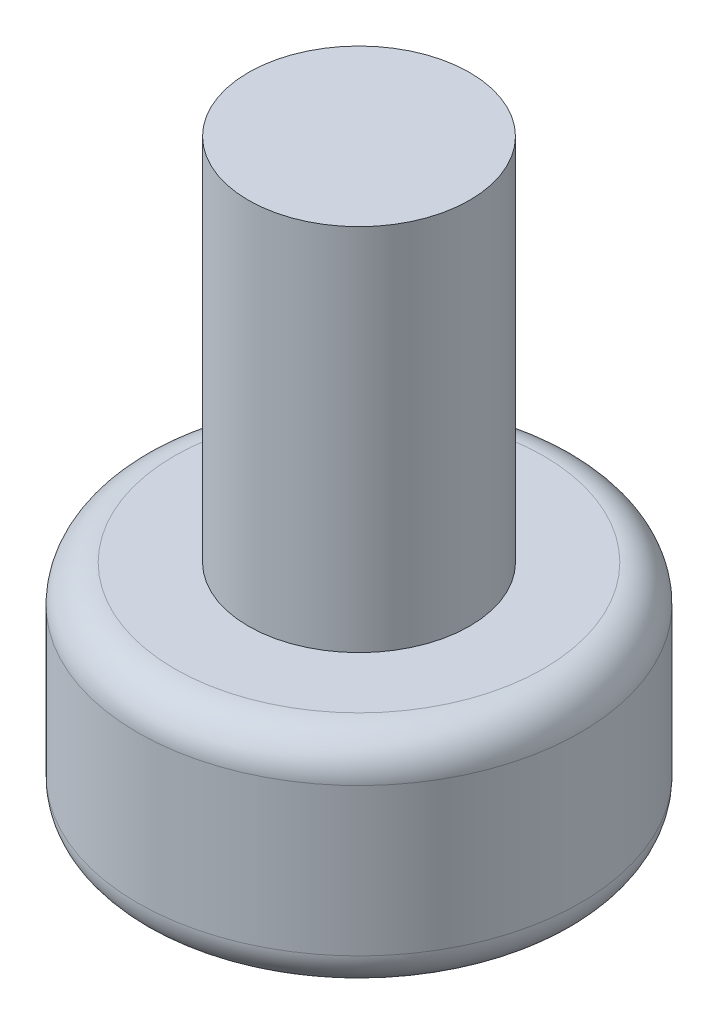
ISO-10303-21;
HEADER;
FILE_DESCRIPTION(('STEP AP214'),'2;1');
FILE_NAME('part.step','',(''),(''),'','','');
FILE_SCHEMA(('AUTOMOTIVE_DESIGN { 1 0 10303 214 1 1 1 1 }'));
ENDSEC;
DATA;
#1=APPLICATION_CONTEXT('core data for automotive mechanical design processes');
#2=APPLICATION_PROTOCOL_DEFINITION('international standard','automotive_design',2000,#1);
#3=PRODUCT_CONTEXT('',#1,'mechanical');
#4=PRODUCT('Part','Part','',(#3));
#5=PRODUCT_RELATED_PRODUCT_CATEGORY('part','',(#4));
#6=PRODUCT_DEFINITION_FORMATION('','',#4);
#7=PRODUCT_DEFINITION_CONTEXT('part definition',#1,'design');
#8=PRODUCT_DEFINITION('design','',#6,#7);
#9=PRODUCT_DEFINITION_SHAPE('','',#8);
#10=(LENGTH_UNIT() NAMED_UNIT(*) SI_UNIT(.MILLI.,.METRE.));
#11=(NAMED_UNIT(*) PLANE_ANGLE_UNIT() SI_UNIT($,.RADIAN.));
#12=(NAMED_UNIT(*) SI_UNIT($,.STERADIAN.) SOLID_ANGLE_UNIT());
#13=UNCERTAINTY_MEASURE_WITH_UNIT(LENGTH_MEASURE(1.E-05),#10,'distance_accuracy_value','');
#14=(GEOMETRIC_REPRESENTATION_CONTEXT(3) GLOBAL_UNCERTAINTY_ASSIGNED_CONTEXT((#13)) GLOBAL_UNIT_ASSIGNED_CONTEXT((#10,
#11,#12)) REPRESENTATION_CONTEXT('',''));
#15=CARTESIAN_POINT('',(0.,0.,0.));
#16=DIRECTION('',(0.,0.,1.));
#17=DIRECTION('',(1.,0.,0.));
#18=AXIS2_PLACEMENT_3D('',#15,#16,#17);
#19=CARTESIAN_POINT('',(0.,3.,0.));
#20=DIRECTION('',(0.,-1.,0.));
#21=DIRECTION('',(0.,0.,-1.));
#22=AXIS2_PLACEMENT_3D('',#19,#20,#21);
#23=CYLINDRICAL_SURFACE('',#22,3.);
#24=CARTESIAN_POINT('',(0.,0.5,0.));
#25=DIRECTION('',(0.,1.,0.));
#26=DIRECTION('',(0.,0.,1.));
#27=AXIS2_PLACEMENT_3D('',#24,#25,#26);
#28=CIRCLE('',#27,3.);
#29=CARTESIAN_POINT('',(0.,0.5,3.));
#30=VERTEX_POINT('',#29);
#31=EDGE_CURVE('E148',#30,#30,#28,.T.);
#32=ORIENTED_EDGE('',*,*,#31,.T.);
#33=EDGE_LOOP('',(#32));
#34=FACE_BOUND('',#33,.T.);
#35=CARTESIAN_POINT('',(0.,2.5,0.));
#36=DIRECTION('',(0.,1.,0.));
#37=DIRECTION('',(0.,0.,1.));
#38=AXIS2_PLACEMENT_3D('',#35,#36,#37);
#39=CIRCLE('',#38,3.);
#40=CARTESIAN_POINT('',(0.,2.5,3.));
#41=VERTEX_POINT('',#40);
#42=EDGE_CURVE('E143',#41,#41,#39,.F.);
#43=ORIENTED_EDGE('',*,*,#42,.T.);
#44=EDGE_LOOP('',(#43));
#45=FACE_BOUND('',#44,.T.);
#46=ADVANCED_FACE('F32',(#34,#45),#23,.T.);
#47=CARTESIAN_POINT('',(0.,3.,0.));
#48=DIRECTION('',(0.,1.,0.));
#49=DIRECTION('',(0.,0.,1.));
#50=AXIS2_PLACEMENT_3D('',#47,#48,#49);
#51=PLANE('',#50);
#52=CARTESIAN_POINT('',(0.,3.,0.));
#53=DIRECTION('',(0.,1.,0.));
#54=DIRECTION('',(0.,0.,1.));
#55=AXIS2_PLACEMENT_3D('',#52,#53,#54);
#56=CIRCLE('',#55,2.5);
#57=CARTESIAN_POINT('',(0.,3.,2.5));
#58=VERTEX_POINT('',#57);
#59=EDGE_CURVE('E11',#58,#58,#56,.T.);
#60=ORIENTED_EDGE('',*,*,#59,.T.);
#61=EDGE_LOOP('',(#60));
#62=FACE_BOUND('',#61,.T.);
#63=CARTESIAN_POINT('',(0.,3.,0.));
#64=DIRECTION('',(0.,1.,0.));
#65=DIRECTION('',(0.,0.,1.));
#66=AXIS2_PLACEMENT_3D('',#63,#64,#65);
#67=CIRCLE('',#66,1.5);
#68=CARTESIAN_POINT('',(0.,3.,1.5));
#69=VERTEX_POINT('',#68);
#70=EDGE_CURVE('E134',#69,#69,#67,.T.);
#71=ORIENTED_EDGE('',*,*,#70,.F.);
#72=EDGE_LOOP('',(#71));
#73=FACE_BOUND('',#72,.T.);
#74=ADVANCED_FACE('F163',(#62,#73),#51,.T.);
#75=CARTESIAN_POINT('',(0.,0.,0.));
#76=DIRECTION('',(0.,1.,0.));
#77=DIRECTION('',(0.,0.,1.));
#78=AXIS2_PLACEMENT_3D('',#75,#76,#77);
#79=PLANE('',#78);
#80=DIRECTION('',(-0.5,0.,0.866025403784438));
#81=VECTOR('',#80,1.);
#82=CARTESIAN_POINT('',(1.73205080756888,0.,0.));
#83=LINE('',#82,#81);
#84=CARTESIAN_POINT('',(1.73205080756888,0.,0.));
#85=VERTEX_POINT('',#84);
#86=CARTESIAN_POINT('',(0.866025403784438,0.,1.5));
#87=VERTEX_POINT('',#86);
#88=EDGE_CURVE('E121',#85,#87,#83,.T.);
#89=ORIENTED_EDGE('',*,*,#88,.F.);
#90=DIRECTION('',(0.5,0.,0.866025403784439));
#91=VECTOR('',#90,1.);
#92=CARTESIAN_POINT('',(0.866025403784438,0.,-1.5));
#93=LINE('',#92,#91);
#94=CARTESIAN_POINT('',(0.866025403784438,0.,-1.5));
#95=VERTEX_POINT('',#94);
#96=EDGE_CURVE('E47',#95,#85,#93,.T.);
#97=ORIENTED_EDGE('',*,*,#96,.F.);
#98=DIRECTION('',(1.,0.,0.));
#99=VECTOR('',#98,1.);
#100=CARTESIAN_POINT('',(-0.866025403784439,0.,-1.5));
#101=LINE('',#100,#99);
#102=CARTESIAN_POINT('',(-0.866025403784439,0.,-1.5));
#103=VERTEX_POINT('',#102);
#104=EDGE_CURVE('E130',#103,#95,#101,.T.);
#105=ORIENTED_EDGE('',*,*,#104,.F.);
#106=DIRECTION('',(0.5,0.,-0.866025403784439));
#107=VECTOR('',#106,1.);
#108=CARTESIAN_POINT('',(-1.73205080756888,0.,0.));
#109=LINE('',#108,#107);
#110=CARTESIAN_POINT('',(-1.73205080756888,0.,0.));
#111=VERTEX_POINT('',#110);
#112=EDGE_CURVE('E128',#111,#103,#109,.T.);
#113=ORIENTED_EDGE('',*,*,#112,.F.);
#114=DIRECTION('',(-0.5,0.,-0.866025403784439));
#115=VECTOR('',#114,1.);
#116=CARTESIAN_POINT('',(-0.866025403784439,0.,1.5));
#117=LINE('',#116,#115);
#118=CARTESIAN_POINT('',(-0.866025403784439,0.,1.5));
#119=VERTEX_POINT('',#118);
#120=EDGE_CURVE('E95',#119,#111,#117,.T.);
#121=ORIENTED_EDGE('',*,*,#120,.F.);
#122=DIRECTION('',(-1.,0.,0.));
#123=VECTOR('',#122,1.);
#124=CARTESIAN_POINT('',(0.866025403784438,0.,1.5));
#125=LINE('',#124,#123);
#126=EDGE_CURVE('E124',#87,#119,#125,.T.);
#127=ORIENTED_EDGE('',*,*,#126,.F.);
#128=EDGE_LOOP('',(#89,#97,#105,#113,#121,#127));
#129=FACE_BOUND('',#128,.T.);
#130=CARTESIAN_POINT('',(0.,0.,0.));
#131=DIRECTION('',(0.,1.,0.));
#132=DIRECTION('',(0.,0.,1.));
#133=AXIS2_PLACEMENT_3D('',#130,#131,#132);
#134=CIRCLE('',#133,2.5);
#135=CARTESIAN_POINT('',(0.,0.,2.5));
#136=VERTEX_POINT('',#135);
#137=EDGE_CURVE('E40',#136,#136,#134,.F.);
#138=ORIENTED_EDGE('',*,*,#137,.T.);
#139=EDGE_LOOP('',(#138));
#140=FACE_BOUND('',#139,.T.);
#141=ADVANCED_FACE('F153',(#129,#140),#79,.F.);
#142=CARTESIAN_POINT('',(0.,8.,0.));
#143=DIRECTION('',(0.,-1.,0.));
#144=DIRECTION('',(0.,0.,-1.));
#145=AXIS2_PLACEMENT_3D('',#142,#143,#144);
#146=CYLINDRICAL_SURFACE('',#145,1.5);
#147=CARTESIAN_POINT('',(0.,8.,0.));
#148=DIRECTION('',(0.,1.,0.));
#149=DIRECTION('',(0.,0.,1.));
#150=AXIS2_PLACEMENT_3D('',#147,#148,#149);
#151=CIRCLE('',#150,1.5);
#152=CARTESIAN_POINT('',(0.,8.,1.5));
#153=VERTEX_POINT('',#152);
#154=EDGE_CURVE('E140',#153,#153,#151,.T.);
#155=ORIENTED_EDGE('',*,*,#154,.F.);
#156=EDGE_LOOP('',(#155));
#157=FACE_BOUND('',#156,.T.);
#158=ORIENTED_EDGE('',*,*,#70,.T.);
#159=EDGE_LOOP('',(#158));
#160=FACE_BOUND('',#159,.T.);
#161=ADVANCED_FACE('F177',(#157,#160),#146,.T.);
#162=CARTESIAN_POINT('',(0.,8.,0.));
#163=DIRECTION('',(0.,1.,0.));
#164=DIRECTION('',(0.,0.,1.));
#165=AXIS2_PLACEMENT_3D('',#162,#163,#164);
#166=PLANE('',#165);
#167=ORIENTED_EDGE('',*,*,#154,.T.);
#168=EDGE_LOOP('',(#167));
#169=FACE_BOUND('',#168,.T.);
#170=ADVANCED_FACE('F158',(#169),#166,.T.);
#171=CARTESIAN_POINT('',(0.,0.5,0.));
#172=DIRECTION('',(0.,1.,0.));
#173=DIRECTION('',(0.,0.,1.));
#174=AXIS2_PLACEMENT_3D('',#171,#172,#173);
#175=TOROIDAL_SURFACE('',#174,2.5,0.5);
#176=ORIENTED_EDGE('',*,*,#137,.F.);
#177=EDGE_LOOP('',(#176));
#178=FACE_BOUND('',#177,.T.);
#179=ORIENTED_EDGE('',*,*,#31,.F.);
#180=EDGE_LOOP('',(#179));
#181=FACE_BOUND('',#180,.T.);
#182=ADVANCED_FACE('F155',(#178,#181),#175,.T.);
#183=CARTESIAN_POINT('',(0.,2.5,0.));
#184=DIRECTION('',(0.,1.,0.));
#185=DIRECTION('',(0.,0.,1.));
#186=AXIS2_PLACEMENT_3D('',#183,#184,#185);
#187=TOROIDAL_SURFACE('',#186,2.5,0.5);
#188=ORIENTED_EDGE('',*,*,#42,.F.);
#189=EDGE_LOOP('',(#188));
#190=FACE_BOUND('',#189,.T.);
#191=ORIENTED_EDGE('',*,*,#59,.F.);
#192=EDGE_LOOP('',(#191));
#193=FACE_BOUND('',#192,.T.);
#194=ADVANCED_FACE('F34',(#190,#193),#187,.T.);
#195=CARTESIAN_POINT('',(0.866025403784438,2.,-1.5));
#196=DIRECTION('',(0.866025403784439,0.,-0.5));
#197=DIRECTION('',(-0.5,0.,-0.866025403784439));
#198=AXIS2_PLACEMENT_3D('',#195,#196,#197);
#199=PLANE('',#198);
#200=ORIENTED_EDGE('',*,*,#96,.T.);
#201=DIRECTION('',(0.,-1.,0.));
#202=VECTOR('',#201,1.);
#203=CARTESIAN_POINT('',(1.73205080756888,2.,0.));
#204=LINE('',#203,#202);
#205=CARTESIAN_POINT('',(1.73205080756888,2.,0.));
#206=VERTEX_POINT('',#205);
#207=EDGE_CURVE('E77',#206,#85,#204,.T.);
#208=ORIENTED_EDGE('',*,*,#207,.F.);
#209=DIRECTION('',(0.5,0.,0.866025403784439));
#210=VECTOR('',#209,1.);
#211=CARTESIAN_POINT('',(0.866025403784438,2.,-1.5));
#212=LINE('',#211,#210);
#213=CARTESIAN_POINT('',(0.866025403784438,2.,-1.5));
#214=VERTEX_POINT('',#213);
#215=EDGE_CURVE('E132',#214,#206,#212,.T.);
#216=ORIENTED_EDGE('',*,*,#215,.F.);
#217=DIRECTION('',(0.,-1.,0.));
#218=VECTOR('',#217,1.);
#219=CARTESIAN_POINT('',(0.866025403784438,2.,-1.5));
#220=LINE('',#219,#218);
#221=EDGE_CURVE('E55',#214,#95,#220,.T.);
#222=ORIENTED_EDGE('',*,*,#221,.T.);
#223=EDGE_LOOP('',(#200,#208,#216,#222));
#224=FACE_BOUND('',#223,.T.);
#225=ADVANCED_FACE('F169',(#224),#199,.F.);
#226=CARTESIAN_POINT('',(-0.866025403784439,2.,-1.5));
#227=DIRECTION('',(0.,0.,-1.));
#228=DIRECTION('',(-1.,0.,0.));
#229=AXIS2_PLACEMENT_3D('',#226,#227,#228);
#230=PLANE('',#229);
#231=ORIENTED_EDGE('',*,*,#104,.T.);
#232=ORIENTED_EDGE('',*,*,#221,.F.);
#233=DIRECTION('',(1.,0.,0.));
#234=VECTOR('',#233,1.);
#235=CARTESIAN_POINT('',(-0.866025403784439,2.,-1.5));
#236=LINE('',#235,#234);
#237=CARTESIAN_POINT('',(-0.866025403784439,2.,-1.5));
#238=VERTEX_POINT('',#237);
#239=EDGE_CURVE('E107',#238,#214,#236,.T.);
#240=ORIENTED_EDGE('',*,*,#239,.F.);
#241=DIRECTION('',(0.,-1.,0.));
#242=VECTOR('',#241,1.);
#243=CARTESIAN_POINT('',(-0.866025403784439,2.,-1.5));
#244=LINE('',#243,#242);
#245=EDGE_CURVE('E99',#238,#103,#244,.T.);
#246=ORIENTED_EDGE('',*,*,#245,.T.);
#247=EDGE_LOOP('',(#231,#232,#240,#246));
#248=FACE_BOUND('',#247,.T.);
#249=ADVANCED_FACE('F193',(#248),#230,.F.);
#250=CARTESIAN_POINT('',(-1.73205080756888,2.,0.));
#251=DIRECTION('',(-0.866025403784439,0.,-0.5));
#252=DIRECTION('',(-0.5,0.,0.866025403784439));
#253=AXIS2_PLACEMENT_3D('',#250,#251,#252);
#254=PLANE('',#253);
#255=ORIENTED_EDGE('',*,*,#112,.T.);
#256=ORIENTED_EDGE('',*,*,#245,.F.);
#257=DIRECTION('',(0.5,0.,-0.866025403784439));
#258=VECTOR('',#257,1.);
#259=CARTESIAN_POINT('',(-1.73205080756888,2.,0.));
#260=LINE('',#259,#258);
#261=CARTESIAN_POINT('',(-1.73205080756888,2.,0.));
#262=VERTEX_POINT('',#261);
#263=EDGE_CURVE('E103',#262,#238,#260,.T.);
#264=ORIENTED_EDGE('',*,*,#263,.F.);
#265=DIRECTION('',(0.,-1.,0.));
#266=VECTOR('',#265,1.);
#267=CARTESIAN_POINT('',(-1.73205080756888,2.,0.));
#268=LINE('',#267,#266);
#269=EDGE_CURVE('E88',#262,#111,#268,.T.);
#270=ORIENTED_EDGE('',*,*,#269,.T.);
#271=EDGE_LOOP('',(#255,#256,#264,#270));
#272=FACE_BOUND('',#271,.T.);
#273=ADVANCED_FACE('F104',(#272),#254,.F.);
#274=CARTESIAN_POINT('',(-0.866025403784439,2.,1.5));
#275=DIRECTION('',(-0.866025403784439,0.,0.5));
#276=DIRECTION('',(0.5,0.,0.866025403784439));
#277=AXIS2_PLACEMENT_3D('',#274,#275,#276);
#278=PLANE('',#277);
#279=ORIENTED_EDGE('',*,*,#120,.T.);
#280=ORIENTED_EDGE('',*,*,#269,.F.);
#281=DIRECTION('',(-0.5,0.,-0.866025403784439));
#282=VECTOR('',#281,1.);
#283=CARTESIAN_POINT('',(-0.866025403784439,2.,1.5));
#284=LINE('',#283,#282);
#285=CARTESIAN_POINT('',(-0.866025403784439,2.,1.5));
#286=VERTEX_POINT('',#285);
#287=EDGE_CURVE('E92',#286,#262,#284,.T.);
#288=ORIENTED_EDGE('',*,*,#287,.F.);
#289=DIRECTION('',(0.,-1.,0.));
#290=VECTOR('',#289,1.);
#291=CARTESIAN_POINT('',(-0.866025403784439,2.,1.5));
#292=LINE('',#291,#290);
#293=EDGE_CURVE('E100',#286,#119,#292,.T.);
#294=ORIENTED_EDGE('',*,*,#293,.T.);
#295=EDGE_LOOP('',(#279,#280,#288,#294));
#296=FACE_BOUND('',#295,.T.);
#297=ADVANCED_FACE('F90',(#296),#278,.F.);
#298=CARTESIAN_POINT('',(0.866025403784438,2.,1.5));
#299=DIRECTION('',(0.,0.,1.));
#300=DIRECTION('',(1.,0.,0.));
#301=AXIS2_PLACEMENT_3D('',#298,#299,#300);
#302=PLANE('',#301);
#303=ORIENTED_EDGE('',*,*,#126,.T.);
#304=ORIENTED_EDGE('',*,*,#293,.F.);
#305=DIRECTION('',(-1.,0.,0.));
#306=VECTOR('',#305,1.);
#307=CARTESIAN_POINT('',(0.866025403784438,2.,1.5));
#308=LINE('',#307,#306);
#309=CARTESIAN_POINT('',(0.866025403784438,2.,1.5));
#310=VERTEX_POINT('',#309);
#311=EDGE_CURVE('E113',#310,#286,#308,.T.);
#312=ORIENTED_EDGE('',*,*,#311,.F.);
#313=DIRECTION('',(0.,-1.,0.));
#314=VECTOR('',#313,1.);
#315=CARTESIAN_POINT('',(0.866025403784438,2.,1.5));
#316=LINE('',#315,#314);
#317=EDGE_CURVE('E137',#310,#87,#316,.T.);
#318=ORIENTED_EDGE('',*,*,#317,.T.);
#319=EDGE_LOOP('',(#303,#304,#312,#318));
#320=FACE_BOUND('',#319,.T.);
#321=ADVANCED_FACE('F197',(#320),#302,.F.);
#322=CARTESIAN_POINT('',(1.73205080756888,2.,0.));
#323=DIRECTION('',(0.866025403784438,0.,0.5));
#324=DIRECTION('',(0.5,0.,-0.866025403784438));
#325=AXIS2_PLACEMENT_3D('',#322,#323,#324);
#326=PLANE('',#325);
#327=ORIENTED_EDGE('',*,*,#88,.T.);
#328=ORIENTED_EDGE('',*,*,#317,.F.);
#329=DIRECTION('',(-0.5,0.,0.866025403784438));
#330=VECTOR('',#329,1.);
#331=CARTESIAN_POINT('',(1.73205080756888,2.,0.));
#332=LINE('',#331,#330);
#333=EDGE_CURVE('E115',#206,#310,#332,.T.);
#334=ORIENTED_EDGE('',*,*,#333,.F.);
#335=ORIENTED_EDGE('',*,*,#207,.T.);
#336=EDGE_LOOP('',(#327,#328,#334,#335));
#337=FACE_BOUND('',#336,.T.);
#338=ADVANCED_FACE('F194',(#337),#326,.F.);
#339=CARTESIAN_POINT('',(0.,2.,0.));
#340=DIRECTION('',(0.,-1.,0.));
#341=DIRECTION('',(0.,0.,-1.));
#342=AXIS2_PLACEMENT_3D('',#339,#340,#341);
#343=PLANE('',#342);
#344=ORIENTED_EDGE('',*,*,#215,.T.);
#345=ORIENTED_EDGE('',*,*,#333,.T.);
#346=ORIENTED_EDGE('',*,*,#311,.T.);
#347=ORIENTED_EDGE('',*,*,#287,.T.);
#348=ORIENTED_EDGE('',*,*,#263,.T.);
#349=ORIENTED_EDGE('',*,*,#239,.T.);
#350=EDGE_LOOP('',(#344,#345,#346,#347,#348,#349));
#351=FACE_BOUND('',#350,.T.);
#352=ADVANCED_FACE('F110',(#351),#343,.T.);
#353=CLOSED_SHELL('',(#46,#74,#141,#161,#170,#182,#194,#225,#249,#273,#297,#321,#338,#352));
#354=MANIFOLD_SOLID_BREP('B2',#353);
#355=ADVANCED_BREP_SHAPE_REPRESENTATION('',(#18,#354),#14);
#356=SHAPE_DEFINITION_REPRESENTATION(#9,#355);
ENDSEC;
END-ISO-10303-21;
